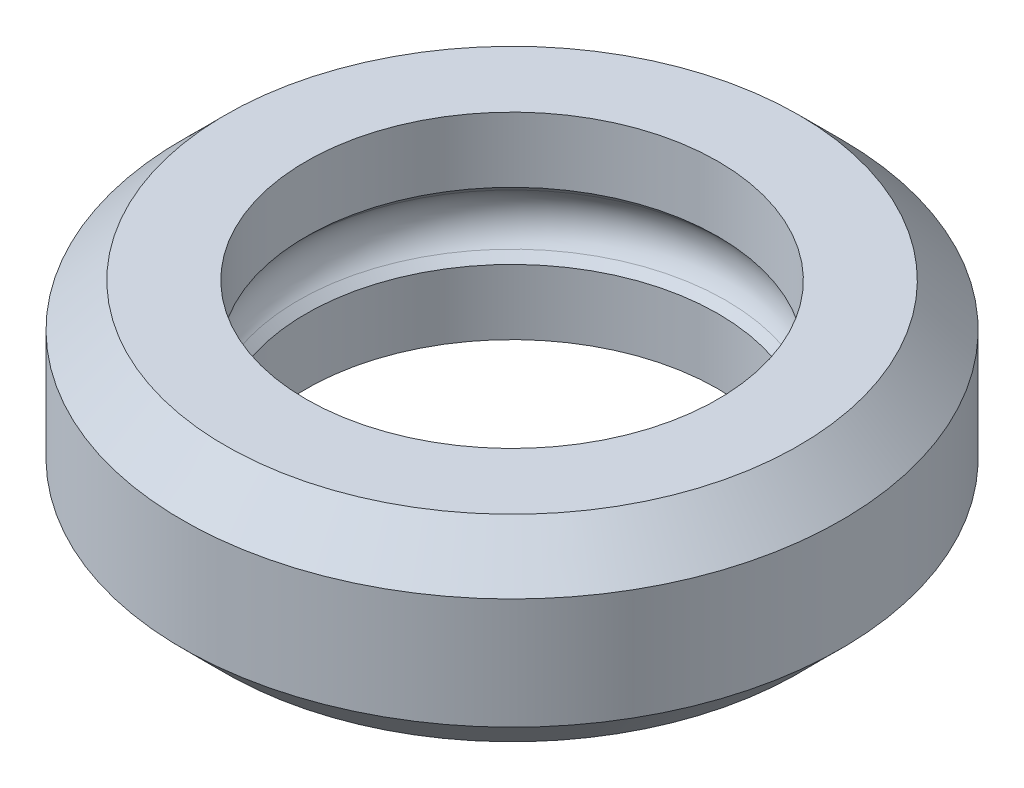
ISO-10303-21;
HEADER;
FILE_DESCRIPTION(('STEP AP214'),'2;1');
FILE_NAME('part.step','',(''),(''),'','','');
FILE_SCHEMA(('AUTOMOTIVE_DESIGN { 1 0 10303 214 1 1 1 1 }'));
ENDSEC;
DATA;
#1=APPLICATION_CONTEXT('core data for automotive mechanical design processes');
#2=APPLICATION_PROTOCOL_DEFINITION('international standard','automotive_design',2000,#1);
#3=PRODUCT_CONTEXT('',#1,'mechanical');
#4=PRODUCT('Part','Part','',(#3));
#5=PRODUCT_RELATED_PRODUCT_CATEGORY('part','',(#4));
#6=PRODUCT_DEFINITION_FORMATION('','',#4);
#7=PRODUCT_DEFINITION_CONTEXT('part definition',#1,'design');
#8=PRODUCT_DEFINITION('design','',#6,#7);
#9=PRODUCT_DEFINITION_SHAPE('','',#8);
#10=(LENGTH_UNIT() NAMED_UNIT(*) SI_UNIT(.MILLI.,.METRE.));
#11=(NAMED_UNIT(*) PLANE_ANGLE_UNIT() SI_UNIT($,.RADIAN.));
#12=(NAMED_UNIT(*) SI_UNIT($,.STERADIAN.) SOLID_ANGLE_UNIT());
#13=UNCERTAINTY_MEASURE_WITH_UNIT(LENGTH_MEASURE(1.E-05),#10,'distance_accuracy_value','');
#14=(GEOMETRIC_REPRESENTATION_CONTEXT(3) GLOBAL_UNCERTAINTY_ASSIGNED_CONTEXT((#13)) GLOBAL_UNIT_ASSIGNED_CONTEXT((#10,
#11,#12)) REPRESENTATION_CONTEXT('',''));
#15=CARTESIAN_POINT('',(0.,0.,0.));
#16=DIRECTION('',(0.,0.,1.));
#17=DIRECTION('',(1.,0.,0.));
#18=AXIS2_PLACEMENT_3D('',#15,#16,#17);
#19=CARTESIAN_POINT('',(0.,0.,0.));
#20=DIRECTION('',(0.,-1.,0.));
#21=DIRECTION('',(0.,0.,-1.));
#22=AXIS2_PLACEMENT_3D('',#19,#20,#21);
#23=TOROIDAL_SURFACE('',#22,10.5,2.025);
#24=CARTESIAN_POINT('',(0.,1.43189123190276,0.));
#25=DIRECTION('',(0.,-1.,0.));
#26=DIRECTION('',(0.,0.,-1.));
#27=AXIS2_PLACEMENT_3D('',#24,#25,#26);
#28=CIRCLE('',#27,11.9318912319028);
#29=CARTESIAN_POINT('',(0.,1.43189123190276,-11.9318912319028));
#30=VERTEX_POINT('',#29);
#31=EDGE_CURVE('E86',#30,#30,#28,.T.);
#32=ORIENTED_EDGE('',*,*,#31,.F.);
#33=EDGE_LOOP('',(#32));
#34=FACE_BOUND('',#33,.T.);
#35=CARTESIAN_POINT('',(0.,-1.43189123190276,0.));
#36=DIRECTION('',(0.,-1.,0.));
#37=DIRECTION('',(0.,0.,-1.));
#38=AXIS2_PLACEMENT_3D('',#35,#36,#37);
#39=CIRCLE('',#38,11.9318912319028);
#40=CARTESIAN_POINT('',(0.,-1.43189123190276,-11.9318912319028));
#41=VERTEX_POINT('',#40);
#42=EDGE_CURVE('E10',#41,#41,#39,.T.);
#43=ORIENTED_EDGE('',*,*,#42,.T.);
#44=EDGE_LOOP('',(#43));
#45=FACE_BOUND('',#44,.T.);
#46=ADVANCED_FACE('F43',(#34,#45),#23,.F.);
#47=CARTESIAN_POINT('',(0.,-1.43189123190276,0.));
#48=DIRECTION('',(0.,1.,0.));
#49=DIRECTION('',(0.,0.,1.));
#50=AXIS2_PLACEMENT_3D('',#47,#48,#49);
#51=CONICAL_SURFACE('',#50,11.9318912319028,0.785398163397442);
#52=CARTESIAN_POINT('',(0.,-1.86378246380552,0.));
#53=DIRECTION('',(0.,-1.,0.));
#54=DIRECTION('',(0.,0.,-1.));
#55=AXIS2_PLACEMENT_3D('',#52,#53,#54);
#56=CIRCLE('',#55,11.5);
#57=CARTESIAN_POINT('',(0.,-1.86378246380552,-11.5));
#58=VERTEX_POINT('',#57);
#59=EDGE_CURVE('E50',#58,#58,#56,.T.);
#60=ORIENTED_EDGE('',*,*,#59,.T.);
#61=EDGE_LOOP('',(#60));
#62=FACE_BOUND('',#61,.T.);
#63=ORIENTED_EDGE('',*,*,#42,.F.);
#64=EDGE_LOOP('',(#63));
#65=FACE_BOUND('',#64,.T.);
#66=ADVANCED_FACE('F94',(#62,#65),#51,.F.);
#67=CARTESIAN_POINT('',(0.,0.,0.));
#68=DIRECTION('',(0.,-1.,0.));
#69=DIRECTION('',(0.,0.,-1.));
#70=AXIS2_PLACEMENT_3D('',#67,#68,#69);
#71=CYLINDRICAL_SURFACE('',#70,11.5);
#72=CARTESIAN_POINT('',(0.,-5.5,0.));
#73=DIRECTION('',(0.,-1.,0.));
#74=DIRECTION('',(0.,0.,-1.));
#75=AXIS2_PLACEMENT_3D('',#72,#73,#74);
#76=CIRCLE('',#75,11.5);
#77=CARTESIAN_POINT('',(0.,-5.5,-11.5));
#78=VERTEX_POINT('',#77);
#79=EDGE_CURVE('E55',#78,#78,#76,.T.);
#80=ORIENTED_EDGE('',*,*,#79,.T.);
#81=EDGE_LOOP('',(#80));
#82=FACE_BOUND('',#81,.T.);
#83=ORIENTED_EDGE('',*,*,#59,.F.);
#84=EDGE_LOOP('',(#83));
#85=FACE_BOUND('',#84,.T.);
#86=ADVANCED_FACE('F98',(#82,#85),#71,.F.);
#87=CARTESIAN_POINT('',(0.,-5.5,0.));
#88=DIRECTION('',(0.,-1.,0.));
#89=DIRECTION('',(0.,0.,-1.));
#90=AXIS2_PLACEMENT_3D('',#87,#88,#89);
#91=PLANE('',#90);
#92=CARTESIAN_POINT('',(0.,-5.5,0.));
#93=DIRECTION('',(0.,-1.,0.));
#94=DIRECTION('',(0.,0.,-1.));
#95=AXIS2_PLACEMENT_3D('',#92,#93,#94);
#96=CIRCLE('',#95,16.);
#97=CARTESIAN_POINT('',(0.,-5.5,-16.));
#98=VERTEX_POINT('',#97);
#99=EDGE_CURVE('E60',#98,#98,#96,.T.);
#100=ORIENTED_EDGE('',*,*,#99,.T.);
#101=EDGE_LOOP('',(#100));
#102=FACE_BOUND('',#101,.T.);
#103=ORIENTED_EDGE('',*,*,#79,.F.);
#104=EDGE_LOOP('',(#103));
#105=FACE_BOUND('',#104,.T.);
#106=ADVANCED_FACE('F102',(#102,#105),#91,.T.);
#107=CARTESIAN_POINT('',(0.,-3.1,0.));
#108=DIRECTION('',(0.,1.,0.));
#109=DIRECTION('',(0.,0.,1.));
#110=AXIS2_PLACEMENT_3D('',#107,#108,#109);
#111=CONICAL_SURFACE('',#110,18.4,0.785398163397442);
#112=ORIENTED_EDGE('',*,*,#99,.F.);
#113=EDGE_LOOP('',(#112));
#114=FACE_BOUND('',#113,.T.);
#115=CARTESIAN_POINT('',(0.,-3.1,0.));
#116=DIRECTION('',(0.,-1.,0.));
#117=DIRECTION('',(0.,0.,-1.));
#118=AXIS2_PLACEMENT_3D('',#115,#116,#117);
#119=CIRCLE('',#118,18.4);
#120=CARTESIAN_POINT('',(0.,-3.1,-18.4));
#121=VERTEX_POINT('',#120);
#122=EDGE_CURVE('E66',#121,#121,#119,.T.);
#123=ORIENTED_EDGE('',*,*,#122,.T.);
#124=EDGE_LOOP('',(#123));
#125=FACE_BOUND('',#124,.T.);
#126=ADVANCED_FACE('F109',(#114,#125),#111,.T.);
#127=CARTESIAN_POINT('',(0.,0.,0.));
#128=DIRECTION('',(0.,-1.,0.));
#129=DIRECTION('',(0.,0.,-1.));
#130=AXIS2_PLACEMENT_3D('',#127,#128,#129);
#131=CYLINDRICAL_SURFACE('',#130,18.4);
#132=CARTESIAN_POINT('',(0.,3.1,0.));
#133=DIRECTION('',(0.,-1.,0.));
#134=DIRECTION('',(0.,0.,-1.));
#135=AXIS2_PLACEMENT_3D('',#132,#133,#134);
#136=CIRCLE('',#135,18.4);
#137=CARTESIAN_POINT('',(0.,3.1,-18.4));
#138=VERTEX_POINT('',#137);
#139=EDGE_CURVE('E70',#138,#138,#136,.T.);
#140=ORIENTED_EDGE('',*,*,#139,.T.);
#141=EDGE_LOOP('',(#140));
#142=FACE_BOUND('',#141,.T.);
#143=ORIENTED_EDGE('',*,*,#122,.F.);
#144=EDGE_LOOP('',(#143));
#145=FACE_BOUND('',#144,.T.);
#146=ADVANCED_FACE('F113',(#142,#145),#131,.T.);
#147=CARTESIAN_POINT('',(0.,3.1,0.));
#148=DIRECTION('',(0.,-1.,0.));
#149=DIRECTION('',(0.,0.,-1.));
#150=AXIS2_PLACEMENT_3D('',#147,#148,#149);
#151=CONICAL_SURFACE('',#150,18.4,0.785398163397442);
#152=CARTESIAN_POINT('',(0.,5.5,0.));
#153=DIRECTION('',(0.,-1.,0.));
#154=DIRECTION('',(0.,0.,-1.));
#155=AXIS2_PLACEMENT_3D('',#152,#153,#154);
#156=CIRCLE('',#155,16.);
#157=CARTESIAN_POINT('',(0.,5.5,-16.));
#158=VERTEX_POINT('',#157);
#159=EDGE_CURVE('E74',#158,#158,#156,.T.);
#160=ORIENTED_EDGE('',*,*,#159,.T.);
#161=EDGE_LOOP('',(#160));
#162=FACE_BOUND('',#161,.T.);
#163=ORIENTED_EDGE('',*,*,#139,.F.);
#164=EDGE_LOOP('',(#163));
#165=FACE_BOUND('',#164,.T.);
#166=ADVANCED_FACE('F117',(#162,#165),#151,.T.);
#167=CARTESIAN_POINT('',(0.,5.5,0.));
#168=DIRECTION('',(0.,-1.,0.));
#169=DIRECTION('',(0.,0.,-1.));
#170=AXIS2_PLACEMENT_3D('',#167,#168,#169);
#171=PLANE('',#170);
#172=ORIENTED_EDGE('',*,*,#159,.F.);
#173=EDGE_LOOP('',(#172));
#174=FACE_BOUND('',#173,.T.);
#175=CARTESIAN_POINT('',(0.,5.5,0.));
#176=DIRECTION('',(0.,-1.,0.));
#177=DIRECTION('',(0.,0.,-1.));
#178=AXIS2_PLACEMENT_3D('',#175,#176,#177);
#179=CIRCLE('',#178,11.5);
#180=CARTESIAN_POINT('',(0.,5.5,-11.5));
#181=VERTEX_POINT('',#180);
#182=EDGE_CURVE('E78',#181,#181,#179,.T.);
#183=ORIENTED_EDGE('',*,*,#182,.T.);
#184=EDGE_LOOP('',(#183));
#185=FACE_BOUND('',#184,.T.);
#186=ADVANCED_FACE('F121',(#174,#185),#171,.F.);
#187=CARTESIAN_POINT('',(0.,0.,0.));
#188=DIRECTION('',(0.,-1.,0.));
#189=DIRECTION('',(0.,0.,-1.));
#190=AXIS2_PLACEMENT_3D('',#187,#188,#189);
#191=CYLINDRICAL_SURFACE('',#190,11.5);
#192=ORIENTED_EDGE('',*,*,#182,.F.);
#193=EDGE_LOOP('',(#192));
#194=FACE_BOUND('',#193,.T.);
#195=CARTESIAN_POINT('',(0.,1.86378246380552,0.));
#196=DIRECTION('',(0.,-1.,0.));
#197=DIRECTION('',(0.,0.,-1.));
#198=AXIS2_PLACEMENT_3D('',#195,#196,#197);
#199=CIRCLE('',#198,11.5);
#200=CARTESIAN_POINT('',(0.,1.86378246380552,-11.5));
#201=VERTEX_POINT('',#200);
#202=EDGE_CURVE('E82',#201,#201,#199,.T.);
#203=ORIENTED_EDGE('',*,*,#202,.T.);
#204=EDGE_LOOP('',(#203));
#205=FACE_BOUND('',#204,.T.);
#206=ADVANCED_FACE('F125',(#194,#205),#191,.F.);
#207=CARTESIAN_POINT('',(0.,1.43189123190276,0.));
#208=DIRECTION('',(0.,-1.,0.));
#209=DIRECTION('',(0.,0.,-1.));
#210=AXIS2_PLACEMENT_3D('',#207,#208,#209);
#211=CONICAL_SURFACE('',#210,11.9318912319028,0.785398163397442);
#212=ORIENTED_EDGE('',*,*,#202,.F.);
#213=EDGE_LOOP('',(#212));
#214=FACE_BOUND('',#213,.T.);
#215=ORIENTED_EDGE('',*,*,#31,.T.);
#216=EDGE_LOOP('',(#215));
#217=FACE_BOUND('',#216,.T.);
#218=ADVANCED_FACE('F91',(#214,#217),#211,.F.);
#219=CLOSED_SHELL('',(#46,#66,#86,#106,#126,#146,#166,#186,#206,#218));
#220=MANIFOLD_SOLID_BREP('B2',#219);
#221=ADVANCED_BREP_SHAPE_REPRESENTATION('',(#18,#220),#14);
#222=SHAPE_DEFINITION_REPRESENTATION(#9,#221);
ENDSEC;
END-ISO-10303-21;
